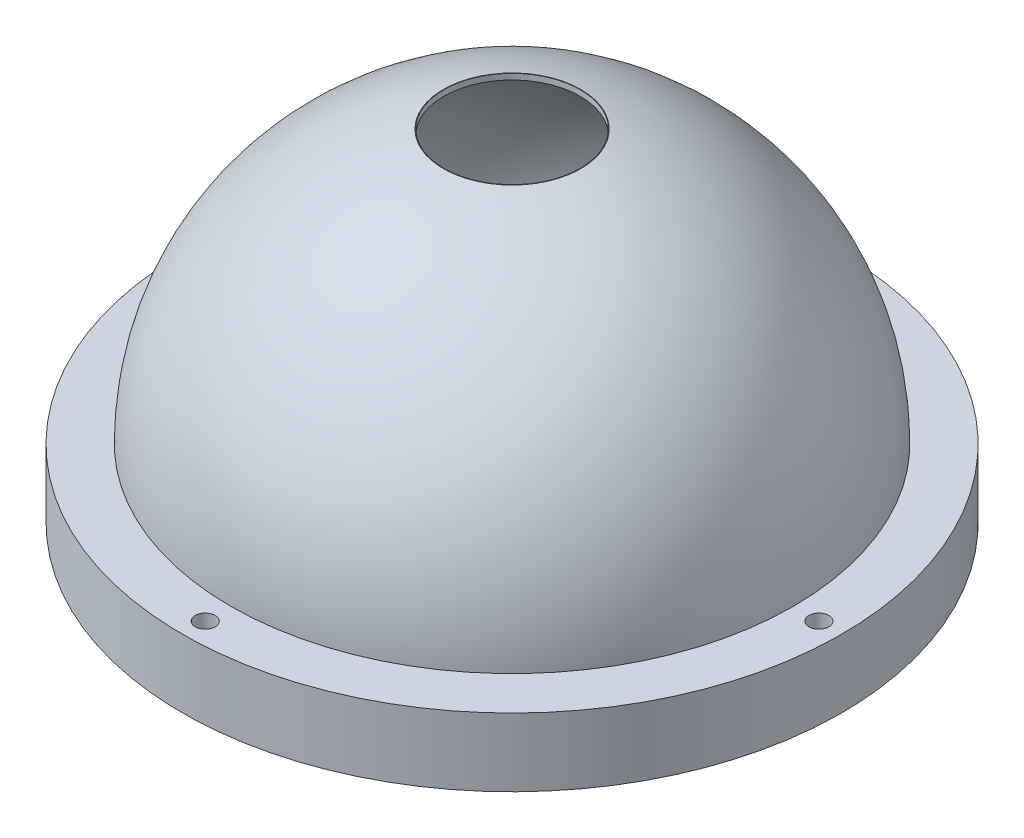
ISO-10303-21;
HEADER;
FILE_DESCRIPTION(('STEP AP214'),'2;1');
FILE_NAME('part.step','',(''),(''),'','','');
FILE_SCHEMA(('AUTOMOTIVE_DESIGN { 1 0 10303 214 1 1 1 1 }'));
ENDSEC;
DATA;
#1=APPLICATION_CONTEXT('core data for automotive mechanical design processes');
#2=APPLICATION_PROTOCOL_DEFINITION('international standard','automotive_design',2000,#1);
#3=PRODUCT_CONTEXT('',#1,'mechanical');
#4=PRODUCT('Part','Part','',(#3));
#5=PRODUCT_RELATED_PRODUCT_CATEGORY('part','',(#4));
#6=PRODUCT_DEFINITION_FORMATION('','',#4);
#7=PRODUCT_DEFINITION_CONTEXT('part definition',#1,'design');
#8=PRODUCT_DEFINITION('design','',#6,#7);
#9=PRODUCT_DEFINITION_SHAPE('','',#8);
#10=(LENGTH_UNIT() NAMED_UNIT(*) SI_UNIT(.MILLI.,.METRE.));
#11=(NAMED_UNIT(*) PLANE_ANGLE_UNIT() SI_UNIT($,.RADIAN.));
#12=(NAMED_UNIT(*) SI_UNIT($,.STERADIAN.) SOLID_ANGLE_UNIT());
#13=UNCERTAINTY_MEASURE_WITH_UNIT(LENGTH_MEASURE(1.E-05),#10,'distance_accuracy_value','');
#14=(GEOMETRIC_REPRESENTATION_CONTEXT(3) GLOBAL_UNCERTAINTY_ASSIGNED_CONTEXT((#13)) GLOBAL_UNIT_ASSIGNED_CONTEXT((#10,
#11,#12)) REPRESENTATION_CONTEXT('',''));
#15=CARTESIAN_POINT('',(0.,0.,0.));
#16=DIRECTION('',(0.,0.,1.));
#17=DIRECTION('',(1.,0.,0.));
#18=AXIS2_PLACEMENT_3D('',#15,#16,#17);
#19=CARTESIAN_POINT('',(0.,48.,0.));
#20=DIRECTION('',(0.,1.,0.));
#21=DIRECTION('',(0.,0.,1.));
#22=AXIS2_PLACEMENT_3D('',#19,#20,#21);
#23=PLANE('',#22);
#24=CARTESIAN_POINT('',(0.,48.,0.));
#25=DIRECTION('',(0.,1.,0.));
#26=DIRECTION('',(0.,0.,1.));
#27=AXIS2_PLACEMENT_3D('',#24,#25,#26);
#28=CIRCLE('',#27,12.);
#29=CARTESIAN_POINT('',(0.,48.,12.));
#30=VERTEX_POINT('',#29);
#31=EDGE_CURVE('E47',#30,#30,#28,.T.);
#32=ORIENTED_EDGE('',*,*,#31,.F.);
#33=EDGE_LOOP('',(#32));
#34=FACE_BOUND('',#33,.T.);
#35=CARTESIAN_POINT('',(0.,48.,0.));
#36=DIRECTION('',(0.,-1.,0.));
#37=DIRECTION('',(0.,0.,-1.));
#38=AXIS2_PLACEMENT_3D('',#35,#36,#37);
#39=CIRCLE('',#38,12.0933866224478);
#40=CARTESIAN_POINT('',(0.,48.,-12.0933866224478));
#41=VERTEX_POINT('',#40);
#42=EDGE_CURVE('E39',#41,#41,#39,.T.);
#43=ORIENTED_EDGE('',*,*,#42,.F.);
#44=EDGE_LOOP('',(#43));
#45=FACE_BOUND('',#44,.T.);
#46=ADVANCED_FACE('F33',(#34,#45),#23,.T.);
#47=CARTESIAN_POINT('',(0.,0.,0.));
#48=DIRECTION('',(0.,-1.,0.));
#49=DIRECTION('',(1.,0.,0.));
#50=AXIS2_PLACEMENT_3D('',#47,#48,#49);
#51=SPHERICAL_SURFACE('',#50,48.5);
#52=CARTESIAN_POINT('',(0.,46.9920205992464,0.));
#53=DIRECTION('',(0.,-1.,0.));
#54=DIRECTION('',(0.,0.,-1.));
#55=AXIS2_PLACEMENT_3D('',#52,#53,#54);
#56=CIRCLE('',#55,12.);
#57=CARTESIAN_POINT('',(0.,46.9920205992464,-12.));
#58=VERTEX_POINT('',#57);
#59=EDGE_CURVE('E43',#58,#58,#56,.T.);
#60=ORIENTED_EDGE('',*,*,#59,.F.);
#61=EDGE_LOOP('',(#60));
#62=FACE_BOUND('',#61,.T.);
#63=CARTESIAN_POINT('',(0.,0.,0.));
#64=DIRECTION('',(0.,-1.,0.));
#65=DIRECTION('',(0.,0.,-1.));
#66=AXIS2_PLACEMENT_3D('',#63,#64,#65);
#67=CIRCLE('',#66,48.5);
#68=CARTESIAN_POINT('',(0.,0.,-48.5));
#69=VERTEX_POINT('',#68);
#70=EDGE_CURVE('E59',#69,#69,#67,.T.);
#71=ORIENTED_EDGE('',*,*,#70,.T.);
#72=EDGE_LOOP('',(#71));
#73=FACE_BOUND('',#72,.T.);
#74=ADVANCED_FACE('F116',(#62,#73),#51,.F.);
#75=CARTESIAN_POINT('',(0.,0.,0.));
#76=DIRECTION('',(0.,-1.,0.));
#77=DIRECTION('',(1.,0.,0.));
#78=AXIS2_PLACEMENT_3D('',#75,#76,#77);
#79=SPHERICAL_SURFACE('',#78,49.5);
#80=ORIENTED_EDGE('',*,*,#42,.T.);
#81=EDGE_LOOP('',(#80));
#82=FACE_BOUND('',#81,.T.);
#83=CARTESIAN_POINT('',(0.,0.,0.));
#84=DIRECTION('',(0.,-1.,0.));
#85=DIRECTION('',(0.,0.,-1.));
#86=AXIS2_PLACEMENT_3D('',#83,#84,#85);
#87=CIRCLE('',#86,49.5);
#88=CARTESIAN_POINT('',(0.,0.,-49.5));
#89=VERTEX_POINT('',#88);
#90=EDGE_CURVE('E10',#89,#89,#87,.T.);
#91=ORIENTED_EDGE('',*,*,#90,.F.);
#92=EDGE_LOOP('',(#91));
#93=FACE_BOUND('',#92,.T.);
#94=ADVANCED_FACE('F118',(#82,#93),#79,.T.);
#95=CARTESIAN_POINT('',(0.,-0.001000000000001,0.));
#96=DIRECTION('',(0.,1.,0.));
#97=DIRECTION('',(0.,0.,1.));
#98=AXIS2_PLACEMENT_3D('',#95,#96,#97);
#99=CYLINDRICAL_SURFACE('',#98,12.);
#100=ORIENTED_EDGE('',*,*,#31,.T.);
#101=EDGE_LOOP('',(#100));
#102=FACE_BOUND('',#101,.T.);
#103=ORIENTED_EDGE('',*,*,#59,.T.);
#104=EDGE_LOOP('',(#103));
#105=FACE_BOUND('',#104,.T.);
#106=ADVANCED_FACE('F96',(#102,#105),#99,.F.);
#107=CARTESIAN_POINT('',(0.,-12.,0.));
#108=DIRECTION('',(0.,-1.,0.));
#109=DIRECTION('',(0.,0.,-1.));
#110=AXIS2_PLACEMENT_3D('',#107,#108,#109);
#111=PLANE('',#110);
#112=CARTESIAN_POINT('',(0.,-12.,54.));
#113=DIRECTION('',(0.,-1.,0.));
#114=DIRECTION('',(0.,0.,-1.));
#115=AXIS2_PLACEMENT_3D('',#112,#113,#114);
#116=CIRCLE('',#115,1.75);
#117=CARTESIAN_POINT('',(0.,-12.,52.25));
#118=VERTEX_POINT('',#117);
#119=EDGE_CURVE('E81',#118,#118,#116,.T.);
#120=ORIENTED_EDGE('',*,*,#119,.F.);
#121=EDGE_LOOP('',(#120));
#122=FACE_BOUND('',#121,.T.);
#123=CARTESIAN_POINT('',(54.,-12.,0.));
#124=DIRECTION('',(0.,-1.,0.));
#125=DIRECTION('',(0.,0.,-1.));
#126=AXIS2_PLACEMENT_3D('',#123,#124,#125);
#127=CIRCLE('',#126,1.75);
#128=CARTESIAN_POINT('',(54.,-12.,-1.75000000000002));
#129=VERTEX_POINT('',#128);
#130=EDGE_CURVE('E75',#129,#129,#127,.T.);
#131=ORIENTED_EDGE('',*,*,#130,.F.);
#132=EDGE_LOOP('',(#131));
#133=FACE_BOUND('',#132,.T.);
#134=CARTESIAN_POINT('',(-54.,-12.,0.));
#135=DIRECTION('',(0.,-1.,0.));
#136=DIRECTION('',(0.,0.,-1.));
#137=AXIS2_PLACEMENT_3D('',#134,#135,#136);
#138=CIRCLE('',#137,1.75);
#139=CARTESIAN_POINT('',(-54.,-12.,-1.75000000000002));
#140=VERTEX_POINT('',#139);
#141=EDGE_CURVE('E68',#140,#140,#138,.T.);
#142=ORIENTED_EDGE('',*,*,#141,.F.);
#143=EDGE_LOOP('',(#142));
#144=FACE_BOUND('',#143,.T.);
#145=CARTESIAN_POINT('',(0.,-12.,-54.));
#146=DIRECTION('',(0.,-1.,0.));
#147=DIRECTION('',(0.,0.,-1.));
#148=AXIS2_PLACEMENT_3D('',#145,#146,#147);
#149=CIRCLE('',#148,1.75);
#150=CARTESIAN_POINT('',(0.,-12.,-55.75));
#151=VERTEX_POINT('',#150);
#152=EDGE_CURVE('E69',#151,#151,#149,.T.);
#153=ORIENTED_EDGE('',*,*,#152,.F.);
#154=EDGE_LOOP('',(#153));
#155=FACE_BOUND('',#154,.T.);
#156=CARTESIAN_POINT('',(0.,-12.,0.));
#157=DIRECTION('',(0.,-1.,0.));
#158=DIRECTION('',(0.,0.,-1.));
#159=AXIS2_PLACEMENT_3D('',#156,#157,#158);
#160=CIRCLE('',#159,58.);
#161=CARTESIAN_POINT('',(0.,-12.,-58.));
#162=VERTEX_POINT('',#161);
#163=EDGE_CURVE('E52',#162,#162,#160,.T.);
#164=ORIENTED_EDGE('',*,*,#163,.T.);
#165=EDGE_LOOP('',(#164));
#166=FACE_BOUND('',#165,.T.);
#167=CARTESIAN_POINT('',(0.,-12.,0.));
#168=DIRECTION('',(0.,-1.,0.));
#169=DIRECTION('',(0.,0.,-1.));
#170=AXIS2_PLACEMENT_3D('',#167,#168,#169);
#171=CIRCLE('',#170,48.5);
#172=CARTESIAN_POINT('',(0.,-12.,-48.5));
#173=VERTEX_POINT('',#172);
#174=EDGE_CURVE('E56',#173,#173,#171,.T.);
#175=ORIENTED_EDGE('',*,*,#174,.F.);
#176=EDGE_LOOP('',(#175));
#177=FACE_BOUND('',#176,.T.);
#178=ADVANCED_FACE('F92',(#122,#133,#144,#155,#166,#177),#111,.T.);
#179=CARTESIAN_POINT('',(0.,0.,0.));
#180=DIRECTION('',(0.,-1.,0.));
#181=DIRECTION('',(0.,0.,-1.));
#182=AXIS2_PLACEMENT_3D('',#179,#180,#181);
#183=PLANE('',#182);
#184=CARTESIAN_POINT('',(0.,0.,54.));
#185=DIRECTION('',(0.,-1.,0.));
#186=DIRECTION('',(0.,0.,-1.));
#187=AXIS2_PLACEMENT_3D('',#184,#185,#186);
#188=CIRCLE('',#187,1.75);
#189=CARTESIAN_POINT('',(0.,0.,52.25));
#190=VERTEX_POINT('',#189);
#191=EDGE_CURVE('E62',#190,#190,#188,.F.);
#192=ORIENTED_EDGE('',*,*,#191,.F.);
#193=EDGE_LOOP('',(#192));
#194=FACE_BOUND('',#193,.T.);
#195=CARTESIAN_POINT('',(54.,0.,0.));
#196=DIRECTION('',(0.,-1.,0.));
#197=DIRECTION('',(0.,0.,-1.));
#198=AXIS2_PLACEMENT_3D('',#195,#196,#197);
#199=CIRCLE('',#198,1.75);
#200=CARTESIAN_POINT('',(54.,0.,-1.75000000000002));
#201=VERTEX_POINT('',#200);
#202=EDGE_CURVE('E78',#201,#201,#199,.F.);
#203=ORIENTED_EDGE('',*,*,#202,.F.);
#204=EDGE_LOOP('',(#203));
#205=FACE_BOUND('',#204,.T.);
#206=CARTESIAN_POINT('',(-54.,0.,0.));
#207=DIRECTION('',(0.,-1.,0.));
#208=DIRECTION('',(0.,0.,-1.));
#209=AXIS2_PLACEMENT_3D('',#206,#207,#208);
#210=CIRCLE('',#209,1.75);
#211=CARTESIAN_POINT('',(-54.,0.,-1.75000000000002));
#212=VERTEX_POINT('',#211);
#213=EDGE_CURVE('E72',#212,#212,#210,.F.);
#214=ORIENTED_EDGE('',*,*,#213,.F.);
#215=EDGE_LOOP('',(#214));
#216=FACE_BOUND('',#215,.T.);
#217=CARTESIAN_POINT('',(0.,0.,-54.));
#218=DIRECTION('',(0.,-1.,0.));
#219=DIRECTION('',(0.,0.,-1.));
#220=AXIS2_PLACEMENT_3D('',#217,#218,#219);
#221=CIRCLE('',#220,1.75);
#222=CARTESIAN_POINT('',(0.,0.,-55.75));
#223=VERTEX_POINT('',#222);
#224=EDGE_CURVE('E65',#223,#223,#221,.F.);
#225=ORIENTED_EDGE('',*,*,#224,.F.);
#226=EDGE_LOOP('',(#225));
#227=FACE_BOUND('',#226,.T.);
#228=ORIENTED_EDGE('',*,*,#90,.T.);
#229=EDGE_LOOP('',(#228));
#230=FACE_BOUND('',#229,.T.);
#231=CARTESIAN_POINT('',(0.,0.,0.));
#232=DIRECTION('',(0.,-1.,0.));
#233=DIRECTION('',(0.,0.,-1.));
#234=AXIS2_PLACEMENT_3D('',#231,#232,#233);
#235=CIRCLE('',#234,58.);
#236=CARTESIAN_POINT('',(0.,0.,-58.));
#237=VERTEX_POINT('',#236);
#238=EDGE_CURVE('E53',#237,#237,#235,.T.);
#239=ORIENTED_EDGE('',*,*,#238,.F.);
#240=EDGE_LOOP('',(#239));
#241=FACE_BOUND('',#240,.T.);
#242=ADVANCED_FACE('F95',(#194,#205,#216,#227,#230,#241),#183,.F.);
#243=CARTESIAN_POINT('',(0.,-12.,0.));
#244=DIRECTION('',(0.,1.,0.));
#245=DIRECTION('',(0.,0.,1.));
#246=AXIS2_PLACEMENT_3D('',#243,#244,#245);
#247=CYLINDRICAL_SURFACE('',#246,58.);
#248=ORIENTED_EDGE('',*,*,#163,.F.);
#249=EDGE_LOOP('',(#248));
#250=FACE_BOUND('',#249,.T.);
#251=ORIENTED_EDGE('',*,*,#238,.T.);
#252=EDGE_LOOP('',(#251));
#253=FACE_BOUND('',#252,.T.);
#254=ADVANCED_FACE('F112',(#250,#253),#247,.T.);
#255=CARTESIAN_POINT('',(0.,-12.,0.));
#256=DIRECTION('',(0.,1.,0.));
#257=DIRECTION('',(0.,0.,1.));
#258=AXIS2_PLACEMENT_3D('',#255,#256,#257);
#259=CYLINDRICAL_SURFACE('',#258,48.5);
#260=ORIENTED_EDGE('',*,*,#174,.T.);
#261=EDGE_LOOP('',(#260));
#262=FACE_BOUND('',#261,.T.);
#263=ORIENTED_EDGE('',*,*,#70,.F.);
#264=EDGE_LOOP('',(#263));
#265=FACE_BOUND('',#264,.T.);
#266=ADVANCED_FACE('F108',(#262,#265),#259,.F.);
#267=CARTESIAN_POINT('',(0.,48.001,-54.));
#268=DIRECTION('',(0.,-1.,0.));
#269=DIRECTION('',(0.,0.,-1.));
#270=AXIS2_PLACEMENT_3D('',#267,#268,#269);
#271=CYLINDRICAL_SURFACE('',#270,1.75);
#272=ORIENTED_EDGE('',*,*,#152,.T.);
#273=EDGE_LOOP('',(#272));
#274=FACE_BOUND('',#273,.T.);
#275=ORIENTED_EDGE('',*,*,#224,.T.);
#276=EDGE_LOOP('',(#275));
#277=FACE_BOUND('',#276,.T.);
#278=ADVANCED_FACE('F111',(#274,#277),#271,.F.);
#279=CARTESIAN_POINT('',(-54.,48.001,0.));
#280=DIRECTION('',(0.,-1.,0.));
#281=DIRECTION('',(0.,0.,-1.));
#282=AXIS2_PLACEMENT_3D('',#279,#280,#281);
#283=CYLINDRICAL_SURFACE('',#282,1.75);
#284=ORIENTED_EDGE('',*,*,#141,.T.);
#285=EDGE_LOOP('',(#284));
#286=FACE_BOUND('',#285,.T.);
#287=ORIENTED_EDGE('',*,*,#213,.T.);
#288=EDGE_LOOP('',(#287));
#289=FACE_BOUND('',#288,.T.);
#290=ADVANCED_FACE('F139',(#286,#289),#283,.F.);
#291=CARTESIAN_POINT('',(54.,48.001,0.));
#292=DIRECTION('',(0.,-1.,0.));
#293=DIRECTION('',(0.,0.,-1.));
#294=AXIS2_PLACEMENT_3D('',#291,#292,#293);
#295=CYLINDRICAL_SURFACE('',#294,1.75);
#296=ORIENTED_EDGE('',*,*,#130,.T.);
#297=EDGE_LOOP('',(#296));
#298=FACE_BOUND('',#297,.T.);
#299=ORIENTED_EDGE('',*,*,#202,.T.);
#300=EDGE_LOOP('',(#299));
#301=FACE_BOUND('',#300,.T.);
#302=ADVANCED_FACE('F143',(#298,#301),#295,.F.);
#303=CARTESIAN_POINT('',(0.,48.001,54.));
#304=DIRECTION('',(0.,-1.,0.));
#305=DIRECTION('',(0.,0.,-1.));
#306=AXIS2_PLACEMENT_3D('',#303,#304,#305);
#307=CYLINDRICAL_SURFACE('',#306,1.75);
#308=ORIENTED_EDGE('',*,*,#119,.T.);
#309=EDGE_LOOP('',(#308));
#310=FACE_BOUND('',#309,.T.);
#311=ORIENTED_EDGE('',*,*,#191,.T.);
#312=EDGE_LOOP('',(#311));
#313=FACE_BOUND('',#312,.T.);
#314=ADVANCED_FACE('F89',(#310,#313),#307,.F.);
#315=CLOSED_SHELL('',(#46,#74,#94,#106,#178,#242,#254,#266,#278,#290,#302,#314));
#316=MANIFOLD_SOLID_BREP('B2',#315);
#317=ADVANCED_BREP_SHAPE_REPRESENTATION('',(#18,#316),#14);
#318=SHAPE_DEFINITION_REPRESENTATION(#9,#317);
ENDSEC;
END-ISO-10303-21;
